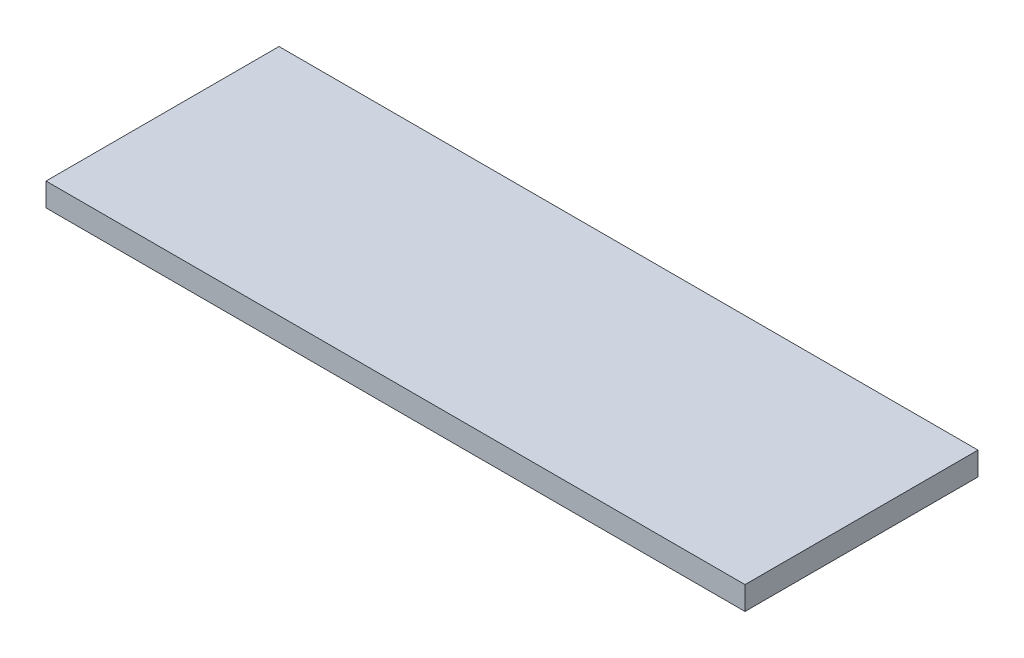
ISO-10303-21;
HEADER;
FILE_DESCRIPTION(('STEP AP214'),'2;1');
FILE_NAME('part.step','',(''),(''),'','','');
FILE_SCHEMA(('AUTOMOTIVE_DESIGN { 1 0 10303 214 1 1 1 1 }'));
ENDSEC;
DATA;
#1=APPLICATION_CONTEXT('core data for automotive mechanical design processes');
#2=APPLICATION_PROTOCOL_DEFINITION('international standard','automotive_design',2000,#1);
#3=PRODUCT_CONTEXT('',#1,'mechanical');
#4=PRODUCT('Part','Part','',(#3));
#5=PRODUCT_RELATED_PRODUCT_CATEGORY('part','',(#4));
#6=PRODUCT_DEFINITION_FORMATION('','',#4);
#7=PRODUCT_DEFINITION_CONTEXT('part definition',#1,'design');
#8=PRODUCT_DEFINITION('design','',#6,#7);
#9=PRODUCT_DEFINITION_SHAPE('','',#8);
#10=(LENGTH_UNIT() NAMED_UNIT(*) SI_UNIT(.MILLI.,.METRE.));
#11=(NAMED_UNIT(*) PLANE_ANGLE_UNIT() SI_UNIT($,.RADIAN.));
#12=(NAMED_UNIT(*) SI_UNIT($,.STERADIAN.) SOLID_ANGLE_UNIT());
#13=UNCERTAINTY_MEASURE_WITH_UNIT(LENGTH_MEASURE(1.E-05),#10,'distance_accuracy_value','');
#14=(GEOMETRIC_REPRESENTATION_CONTEXT(3) GLOBAL_UNCERTAINTY_ASSIGNED_CONTEXT((#13)) GLOBAL_UNIT_ASSIGNED_CONTEXT((#10,
#11,#12)) REPRESENTATION_CONTEXT('',''));
#15=CARTESIAN_POINT('',(0.,0.,0.));
#16=DIRECTION('',(0.,0.,1.));
#17=DIRECTION('',(1.,0.,0.));
#18=AXIS2_PLACEMENT_3D('',#15,#16,#17);
#19=CARTESIAN_POINT('',(-150.,10.,-50.));
#20=DIRECTION('',(1.,0.,0.));
#21=DIRECTION('',(0.,0.,-1.));
#22=AXIS2_PLACEMENT_3D('',#19,#20,#21);
#23=PLANE('',#22);
#24=DIRECTION('',(0.,0.,1.));
#25=VECTOR('',#24,1.);
#26=CARTESIAN_POINT('',(-150.,0.,-50.));
#27=LINE('',#26,#25);
#28=CARTESIAN_POINT('',(-150.,0.,-50.));
#29=VERTEX_POINT('',#28);
#30=CARTESIAN_POINT('',(-150.,0.,50.));
#31=VERTEX_POINT('',#30);
#32=EDGE_CURVE('E97',#29,#31,#27,.T.);
#33=ORIENTED_EDGE('',*,*,#32,.T.);
#34=DIRECTION('',(0.,-1.,0.));
#35=VECTOR('',#34,1.);
#36=CARTESIAN_POINT('',(-150.,10.,50.));
#37=LINE('',#36,#35);
#38=CARTESIAN_POINT('',(-150.,10.,50.));
#39=VERTEX_POINT('',#38);
#40=EDGE_CURVE('E11',#39,#31,#37,.T.);
#41=ORIENTED_EDGE('',*,*,#40,.F.);
#42=DIRECTION('',(0.,0.,1.));
#43=VECTOR('',#42,1.);
#44=CARTESIAN_POINT('',(-150.,10.,-50.));
#45=LINE('',#44,#43);
#46=CARTESIAN_POINT('',(-150.,10.,-50.));
#47=VERTEX_POINT('',#46);
#48=EDGE_CURVE('E85',#47,#39,#45,.T.);
#49=ORIENTED_EDGE('',*,*,#48,.F.);
#50=DIRECTION('',(0.,-1.,0.));
#51=VECTOR('',#50,1.);
#52=CARTESIAN_POINT('',(-150.,10.,-50.));
#53=LINE('',#52,#51);
#54=EDGE_CURVE('E93',#47,#29,#53,.T.);
#55=ORIENTED_EDGE('',*,*,#54,.T.);
#56=EDGE_LOOP('',(#33,#41,#49,#55));
#57=FACE_BOUND('',#56,.T.);
#58=ADVANCED_FACE('F34',(#57),#23,.F.);
#59=CARTESIAN_POINT('',(150.,10.,50.));
#60=DIRECTION('',(0.,0.,-1.));
#61=DIRECTION('',(-1.,0.,0.));
#62=AXIS2_PLACEMENT_3D('',#59,#60,#61);
#63=PLANE('',#62);
#64=DIRECTION('',(1.,0.,0.));
#65=VECTOR('',#64,1.);
#66=CARTESIAN_POINT('',(150.,0.,50.));
#67=LINE('',#66,#65);
#68=CARTESIAN_POINT('',(150.,0.,50.));
#69=VERTEX_POINT('',#68);
#70=EDGE_CURVE('E89',#31,#69,#67,.T.);
#71=ORIENTED_EDGE('',*,*,#70,.T.);
#72=DIRECTION('',(0.,-1.,0.));
#73=VECTOR('',#72,1.);
#74=CARTESIAN_POINT('',(150.,10.,50.));
#75=LINE('',#74,#73);
#76=CARTESIAN_POINT('',(150.,10.,50.));
#77=VERTEX_POINT('',#76);
#78=EDGE_CURVE('E42',#77,#69,#75,.T.);
#79=ORIENTED_EDGE('',*,*,#78,.F.);
#80=DIRECTION('',(1.,0.,0.));
#81=VECTOR('',#80,1.);
#82=CARTESIAN_POINT('',(150.,10.,50.));
#83=LINE('',#82,#81);
#84=EDGE_CURVE('E80',#39,#77,#83,.T.);
#85=ORIENTED_EDGE('',*,*,#84,.F.);
#86=ORIENTED_EDGE('',*,*,#40,.T.);
#87=EDGE_LOOP('',(#71,#79,#85,#86));
#88=FACE_BOUND('',#87,.T.);
#89=ADVANCED_FACE('F88',(#88),#63,.F.);
#90=CARTESIAN_POINT('',(150.,10.,-50.));
#91=DIRECTION('',(-1.,0.,0.));
#92=DIRECTION('',(0.,0.,1.));
#93=AXIS2_PLACEMENT_3D('',#90,#91,#92);
#94=PLANE('',#93);
#95=DIRECTION('',(0.,0.,-1.));
#96=VECTOR('',#95,1.);
#97=CARTESIAN_POINT('',(150.,0.,-50.));
#98=LINE('',#97,#96);
#99=CARTESIAN_POINT('',(150.,0.,-50.));
#100=VERTEX_POINT('',#99);
#101=EDGE_CURVE('E67',#69,#100,#98,.T.);
#102=ORIENTED_EDGE('',*,*,#101,.T.);
#103=DIRECTION('',(0.,-1.,0.));
#104=VECTOR('',#103,1.);
#105=CARTESIAN_POINT('',(150.,10.,-50.));
#106=LINE('',#105,#104);
#107=CARTESIAN_POINT('',(150.,10.,-50.));
#108=VERTEX_POINT('',#107);
#109=EDGE_CURVE('E90',#108,#100,#106,.T.);
#110=ORIENTED_EDGE('',*,*,#109,.F.);
#111=DIRECTION('',(0.,0.,-1.));
#112=VECTOR('',#111,1.);
#113=CARTESIAN_POINT('',(150.,10.,-50.));
#114=LINE('',#113,#112);
#115=EDGE_CURVE('E83',#77,#108,#114,.T.);
#116=ORIENTED_EDGE('',*,*,#115,.F.);
#117=ORIENTED_EDGE('',*,*,#78,.T.);
#118=EDGE_LOOP('',(#102,#110,#116,#117));
#119=FACE_BOUND('',#118,.T.);
#120=ADVANCED_FACE('F91',(#119),#94,.F.);
#121=CARTESIAN_POINT('',(150.,10.,-50.));
#122=DIRECTION('',(0.,0.,1.));
#123=DIRECTION('',(1.,0.,0.));
#124=AXIS2_PLACEMENT_3D('',#121,#122,#123);
#125=PLANE('',#124);
#126=DIRECTION('',(-1.,0.,0.));
#127=VECTOR('',#126,1.);
#128=CARTESIAN_POINT('',(150.,0.,-50.));
#129=LINE('',#128,#127);
#130=EDGE_CURVE('E73',#100,#29,#129,.T.);
#131=ORIENTED_EDGE('',*,*,#130,.T.);
#132=ORIENTED_EDGE('',*,*,#54,.F.);
#133=DIRECTION('',(-1.,0.,0.));
#134=VECTOR('',#133,1.);
#135=CARTESIAN_POINT('',(150.,10.,-50.));
#136=LINE('',#135,#134);
#137=EDGE_CURVE('E50',#108,#47,#136,.T.);
#138=ORIENTED_EDGE('',*,*,#137,.F.);
#139=ORIENTED_EDGE('',*,*,#109,.T.);
#140=EDGE_LOOP('',(#131,#132,#138,#139));
#141=FACE_BOUND('',#140,.T.);
#142=ADVANCED_FACE('F104',(#141),#125,.F.);
#143=CARTESIAN_POINT('',(0.,10.,0.));
#144=DIRECTION('',(0.,-1.,0.));
#145=DIRECTION('',(0.,0.,-1.));
#146=AXIS2_PLACEMENT_3D('',#143,#144,#145);
#147=PLANE('',#146);
#148=ORIENTED_EDGE('',*,*,#48,.T.);
#149=ORIENTED_EDGE('',*,*,#84,.T.);
#150=ORIENTED_EDGE('',*,*,#115,.T.);
#151=ORIENTED_EDGE('',*,*,#137,.T.);
#152=EDGE_LOOP('',(#148,#149,#150,#151));
#153=FACE_BOUND('',#152,.T.);
#154=ADVANCED_FACE('F81',(#153),#147,.F.);
#155=CARTESIAN_POINT('',(0.,0.,0.));
#156=DIRECTION('',(0.,-1.,0.));
#157=DIRECTION('',(0.,0.,-1.));
#158=AXIS2_PLACEMENT_3D('',#155,#156,#157);
#159=PLANE('',#158);
#160=ORIENTED_EDGE('',*,*,#32,.F.);
#161=ORIENTED_EDGE('',*,*,#130,.F.);
#162=ORIENTED_EDGE('',*,*,#101,.F.);
#163=ORIENTED_EDGE('',*,*,#70,.F.);
#164=EDGE_LOOP('',(#160,#161,#162,#163));
#165=FACE_BOUND('',#164,.T.);
#166=ADVANCED_FACE('F107',(#165),#159,.T.);
#167=CLOSED_SHELL('',(#58,#89,#120,#142,#154,#166));
#168=MANIFOLD_SOLID_BREP('B2',#167);
#169=ADVANCED_BREP_SHAPE_REPRESENTATION('',(#18,#168),#14);
#170=SHAPE_DEFINITION_REPRESENTATION(#9,#169);
ENDSEC;
END-ISO-10303-21;
